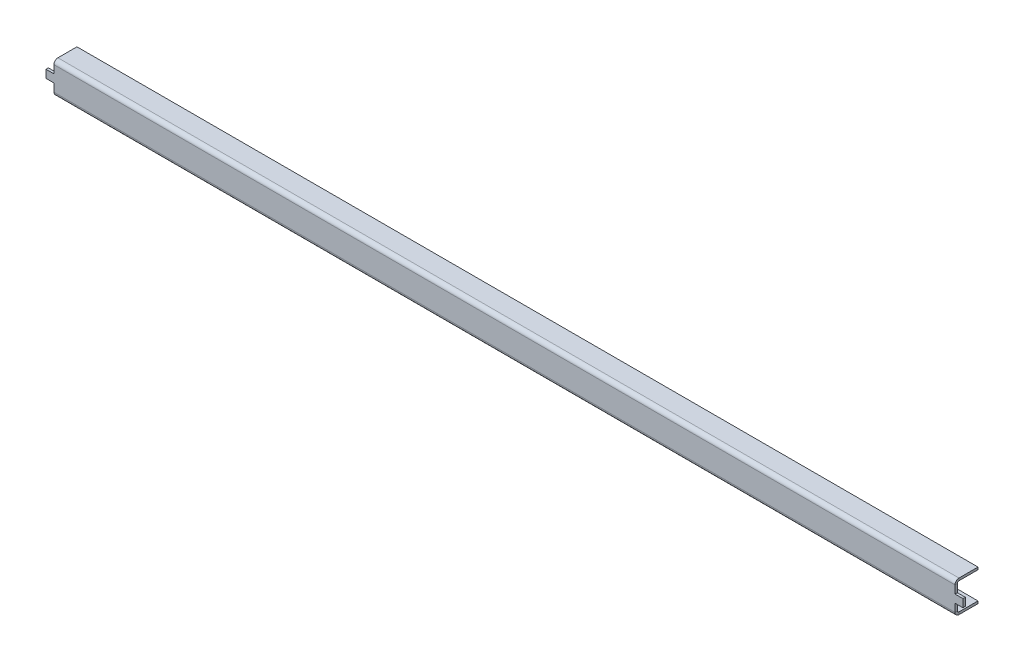
ISO-10303-21;
HEADER;
FILE_DESCRIPTION(('STEP AP214'),'2;1');
FILE_NAME('part.step','',(''),(''),'','','');
FILE_SCHEMA(('AUTOMOTIVE_DESIGN { 1 0 10303 214 1 1 1 1 }'));
ENDSEC;
DATA;
#1=APPLICATION_CONTEXT('core data for automotive mechanical design processes');
#2=APPLICATION_PROTOCOL_DEFINITION('international standard','automotive_design',2000,#1);
#3=PRODUCT_CONTEXT('',#1,'mechanical');
#4=PRODUCT('Part','Part','',(#3));
#5=PRODUCT_RELATED_PRODUCT_CATEGORY('part','',(#4));
#6=PRODUCT_DEFINITION_FORMATION('','',#4);
#7=PRODUCT_DEFINITION_CONTEXT('part definition',#1,'design');
#8=PRODUCT_DEFINITION('design','',#6,#7);
#9=PRODUCT_DEFINITION_SHAPE('','',#8);
#10=(LENGTH_UNIT() NAMED_UNIT(*) SI_UNIT(.MILLI.,.METRE.));
#11=(NAMED_UNIT(*) PLANE_ANGLE_UNIT() SI_UNIT($,.RADIAN.));
#12=(NAMED_UNIT(*) SI_UNIT($,.STERADIAN.) SOLID_ANGLE_UNIT());
#13=UNCERTAINTY_MEASURE_WITH_UNIT(LENGTH_MEASURE(1.E-05),#10,'distance_accuracy_value','');
#14=(GEOMETRIC_REPRESENTATION_CONTEXT(3) GLOBAL_UNCERTAINTY_ASSIGNED_CONTEXT((#13)) GLOBAL_UNIT_ASSIGNED_CONTEXT((#10,
#11,#12)) REPRESENTATION_CONTEXT('',''));
#15=CARTESIAN_POINT('',(0.,0.,0.));
#16=DIRECTION('',(0.,0.,1.));
#17=DIRECTION('',(1.,0.,0.));
#18=AXIS2_PLACEMENT_3D('',#15,#16,#17);
#19=CARTESIAN_POINT('',(284.,1461.75349284392,4.32986979603811E-12));
#20=DIRECTION('',(0.,0.,1.));
#21=DIRECTION('',(0.,-1.,0.));
#22=AXIS2_PLACEMENT_3D('',#19,#20,#21);
#23=PLANE('',#22);
#24=DIRECTION('',(0.,-1.,0.));
#25=VECTOR('',#24,1.);
#26=CARTESIAN_POINT('',(284.,1461.75349284392,4.32986979603811E-12));
#27=LINE('',#26,#25);
#28=CARTESIAN_POINT('',(284.,325.5,0.));
#29=VERTEX_POINT('',#28);
#30=CARTESIAN_POINT('',(284.,324.,0.));
#31=VERTEX_POINT('',#30);
#32=EDGE_CURVE('E289',#29,#31,#27,.T.);
#33=ORIENTED_EDGE('',*,*,#32,.T.);
#34=DIRECTION('',(1.,0.,0.));
#35=VECTOR('',#34,1.);
#36=CARTESIAN_POINT('',(284.,324.,0.));
#37=LINE('',#36,#35);
#38=CARTESIAN_POINT('',(-284.,324.,0.));
#39=VERTEX_POINT('',#38);
#40=EDGE_CURVE('E77',#31,#39,#37,.F.);
#41=ORIENTED_EDGE('',*,*,#40,.T.);
#42=DIRECTION('',(0.,-1.,0.));
#43=VECTOR('',#42,1.);
#44=CARTESIAN_POINT('',(-284.,1461.75349284392,4.32986979603811E-12));
#45=LINE('',#44,#43);
#46=CARTESIAN_POINT('',(-284.,325.5,0.));
#47=VERTEX_POINT('',#46);
#48=EDGE_CURVE('E501',#47,#39,#45,.T.);
#49=ORIENTED_EDGE('',*,*,#48,.F.);
#50=DIRECTION('',(1.,0.,0.));
#51=VECTOR('',#50,1.);
#52=CARTESIAN_POINT('',(284.,325.5,0.));
#53=LINE('',#52,#51);
#54=EDGE_CURVE('E12',#29,#47,#53,.F.);
#55=ORIENTED_EDGE('',*,*,#54,.F.);
#56=EDGE_LOOP('',(#33,#41,#49,#55));
#57=FACE_BOUND('',#56,.T.);
#58=ADVANCED_FACE('F53',(#57),#23,.F.);
#59=CARTESIAN_POINT('',(284.,1461.75349284392,12.0000000000043));
#60=DIRECTION('',(1.,0.,0.));
#61=DIRECTION('',(0.,1.,0.));
#62=AXIS2_PLACEMENT_3D('',#59,#60,#61);
#63=PLANE('',#62);
#64=DIRECTION('',(0.,0.,-1.));
#65=VECTOR('',#64,1.);
#66=CARTESIAN_POINT('',(284.,324.,12.0000000000001));
#67=LINE('',#66,#65);
#68=CARTESIAN_POINT('',(284.,324.,12.));
#69=VERTEX_POINT('',#68);
#70=EDGE_CURVE('E266',#69,#31,#67,.T.);
#71=ORIENTED_EDGE('',*,*,#70,.T.);
#72=ORIENTED_EDGE('',*,*,#32,.F.);
#73=DIRECTION('',(0.,0.,-1.));
#74=VECTOR('',#73,1.);
#75=CARTESIAN_POINT('',(284.,325.5,12.));
#76=LINE('',#75,#74);
#77=CARTESIAN_POINT('',(284.,325.5,12.0000000000001));
#78=VERTEX_POINT('',#77);
#79=EDGE_CURVE('E111',#29,#78,#76,.F.);
#80=ORIENTED_EDGE('',*,*,#79,.T.);
#81=DIRECTION('',(0.,-1.,0.));
#82=VECTOR('',#81,1.);
#83=CARTESIAN_POINT('',(284.,1461.75349284392,12.0000000000044));
#84=LINE('',#83,#82);
#85=EDGE_CURVE('E264',#78,#69,#84,.T.);
#86=ORIENTED_EDGE('',*,*,#85,.T.);
#87=EDGE_LOOP('',(#71,#72,#80,#86));
#88=FACE_BOUND('',#87,.T.);
#89=ADVANCED_FACE('F265',(#88),#63,.T.);
#90=CARTESIAN_POINT('',(284.,324.,14.5000000000001));
#91=DIRECTION('',(0.,1.,0.));
#92=DIRECTION('',(0.,0.,1.));
#93=AXIS2_PLACEMENT_3D('',#90,#91,#92);
#94=PLANE('',#93);
#95=DIRECTION('',(0.,0.,1.));
#96=VECTOR('',#95,1.);
#97=CARTESIAN_POINT('',(-284.,324.,12.));
#98=LINE('',#97,#96);
#99=CARTESIAN_POINT('',(-284.,324.,12.0000000000001));
#100=VERTEX_POINT('',#99);
#101=EDGE_CURVE('E272',#39,#100,#98,.T.);
#102=ORIENTED_EDGE('',*,*,#101,.F.);
#103=ORIENTED_EDGE('',*,*,#40,.F.);
#104=ORIENTED_EDGE('',*,*,#70,.F.);
#105=DIRECTION('',(-1.,0.,0.));
#106=VECTOR('',#105,1.);
#107=CARTESIAN_POINT('',(284.,324.,12.0000000000001));
#108=LINE('',#107,#106);
#109=EDGE_CURVE('E277',#100,#69,#108,.F.);
#110=ORIENTED_EDGE('',*,*,#109,.F.);
#111=EDGE_LOOP('',(#102,#103,#104,#110));
#112=FACE_BOUND('',#111,.T.);
#113=ADVANCED_FACE('F276',(#112),#94,.F.);
#114=CARTESIAN_POINT('',(-284.,1461.75349284392,12.0000000000043));
#115=DIRECTION('',(-1.,0.,0.));
#116=DIRECTION('',(0.,-1.,0.));
#117=AXIS2_PLACEMENT_3D('',#114,#115,#116);
#118=PLANE('',#117);
#119=ORIENTED_EDGE('',*,*,#101,.T.);
#120=DIRECTION('',(0.,-1.,0.));
#121=VECTOR('',#120,1.);
#122=CARTESIAN_POINT('',(-284.,1461.75349284392,12.0000000000044));
#123=LINE('',#122,#121);
#124=CARTESIAN_POINT('',(-284.,325.5,12.0000000000001));
#125=VERTEX_POINT('',#124);
#126=EDGE_CURVE('E58',#125,#100,#123,.T.);
#127=ORIENTED_EDGE('',*,*,#126,.F.);
#128=DIRECTION('',(0.,0.,1.));
#129=VECTOR('',#128,1.);
#130=CARTESIAN_POINT('',(-284.,325.5,12.));
#131=LINE('',#130,#129);
#132=EDGE_CURVE('E485',#125,#47,#131,.F.);
#133=ORIENTED_EDGE('',*,*,#132,.T.);
#134=ORIENTED_EDGE('',*,*,#48,.T.);
#135=EDGE_LOOP('',(#119,#127,#133,#134));
#136=FACE_BOUND('',#135,.T.);
#137=ADVANCED_FACE('F644',(#136),#118,.T.);
#138=CARTESIAN_POINT('',(284.,325.5,14.5000000000001));
#139=DIRECTION('',(0.,1.,0.));
#140=DIRECTION('',(0.,0.,1.));
#141=AXIS2_PLACEMENT_3D('',#138,#139,#140);
#142=PLANE('',#141);
#143=ORIENTED_EDGE('',*,*,#132,.F.);
#144=DIRECTION('',(-1.,0.,0.));
#145=VECTOR('',#144,1.);
#146=CARTESIAN_POINT('',(284.,325.5,12.0000000000001));
#147=LINE('',#146,#145);
#148=EDGE_CURVE('E65',#125,#78,#147,.F.);
#149=ORIENTED_EDGE('',*,*,#148,.T.);
#150=ORIENTED_EDGE('',*,*,#79,.F.);
#151=ORIENTED_EDGE('',*,*,#54,.T.);
#152=EDGE_LOOP('',(#143,#149,#150,#151));
#153=FACE_BOUND('',#152,.T.);
#154=ADVANCED_FACE('F56',(#153),#142,.T.);
#155=CARTESIAN_POINT('',(284.,-793.753492843917,4.38538094726937E-12));
#156=DIRECTION('',(0.,0.,1.));
#157=DIRECTION('',(0.,-1.,0.));
#158=AXIS2_PLACEMENT_3D('',#155,#156,#157);
#159=PLANE('',#158);
#160=DIRECTION('',(0.,1.,0.));
#161=VECTOR('',#160,1.);
#162=CARTESIAN_POINT('',(-284.,-793.753492843917,4.38538094726937E-12));
#163=LINE('',#162,#161);
#164=CARTESIAN_POINT('',(-284.,342.5,0.));
#165=VERTEX_POINT('',#164);
#166=CARTESIAN_POINT('',(-284.,344.,0.));
#167=VERTEX_POINT('',#166);
#168=EDGE_CURVE('E477',#165,#167,#163,.T.);
#169=ORIENTED_EDGE('',*,*,#168,.T.);
#170=DIRECTION('',(1.,0.,0.));
#171=VECTOR('',#170,1.);
#172=CARTESIAN_POINT('',(284.,344.,0.));
#173=LINE('',#172,#171);
#174=CARTESIAN_POINT('',(284.,344.,0.));
#175=VERTEX_POINT('',#174);
#176=EDGE_CURVE('E472',#167,#175,#173,.T.);
#177=ORIENTED_EDGE('',*,*,#176,.T.);
#178=DIRECTION('',(0.,1.,0.));
#179=VECTOR('',#178,1.);
#180=CARTESIAN_POINT('',(284.,-793.753492843917,4.38538094726937E-12));
#181=LINE('',#180,#179);
#182=CARTESIAN_POINT('',(284.,342.5,0.));
#183=VERTEX_POINT('',#182);
#184=EDGE_CURVE('E451',#183,#175,#181,.T.);
#185=ORIENTED_EDGE('',*,*,#184,.F.);
#186=DIRECTION('',(1.,0.,0.));
#187=VECTOR('',#186,1.);
#188=CARTESIAN_POINT('',(284.,342.5,0.));
#189=LINE('',#188,#187);
#190=EDGE_CURVE('E446',#165,#183,#189,.T.);
#191=ORIENTED_EDGE('',*,*,#190,.F.);
#192=EDGE_LOOP('',(#169,#177,#185,#191));
#193=FACE_BOUND('',#192,.T.);
#194=ADVANCED_FACE('F518',(#193),#159,.F.);
#195=CARTESIAN_POINT('',(-284.,-793.753492843917,12.0000000000044));
#196=DIRECTION('',(-1.,0.,0.));
#197=DIRECTION('',(0.,1.,0.));
#198=AXIS2_PLACEMENT_3D('',#195,#196,#197);
#199=PLANE('',#198);
#200=DIRECTION('',(0.,0.,1.));
#201=VECTOR('',#200,1.);
#202=CARTESIAN_POINT('',(-284.,344.,12.));
#203=LINE('',#202,#201);
#204=CARTESIAN_POINT('',(-284.,344.,12.));
#205=VERTEX_POINT('',#204);
#206=EDGE_CURVE('E468',#205,#167,#203,.F.);
#207=ORIENTED_EDGE('',*,*,#206,.T.);
#208=ORIENTED_EDGE('',*,*,#168,.F.);
#209=DIRECTION('',(0.,0.,1.));
#210=VECTOR('',#209,1.);
#211=CARTESIAN_POINT('',(-284.,342.5,12.));
#212=LINE('',#211,#210);
#213=CARTESIAN_POINT('',(-284.,342.5,12.));
#214=VERTEX_POINT('',#213);
#215=EDGE_CURVE('E155',#165,#214,#212,.T.);
#216=ORIENTED_EDGE('',*,*,#215,.T.);
#217=DIRECTION('',(0.,1.,0.));
#218=VECTOR('',#217,1.);
#219=CARTESIAN_POINT('',(-284.,-793.753492843917,12.0000000000044));
#220=LINE('',#219,#218);
#221=EDGE_CURVE('E463',#214,#205,#220,.T.);
#222=ORIENTED_EDGE('',*,*,#221,.T.);
#223=EDGE_LOOP('',(#207,#208,#216,#222));
#224=FACE_BOUND('',#223,.T.);
#225=ADVANCED_FACE('F519',(#224),#199,.T.);
#226=CARTESIAN_POINT('',(284.,344.,0.));
#227=DIRECTION('',(0.,-1.,0.));
#228=DIRECTION('',(0.,0.,-1.));
#229=AXIS2_PLACEMENT_3D('',#226,#227,#228);
#230=PLANE('',#229);
#231=ORIENTED_EDGE('',*,*,#206,.F.);
#232=DIRECTION('',(-1.,0.,0.));
#233=VECTOR('',#232,1.);
#234=CARTESIAN_POINT('',(284.,344.,12.));
#235=LINE('',#234,#233);
#236=CARTESIAN_POINT('',(284.,344.,12.));
#237=VERTEX_POINT('',#236);
#238=EDGE_CURVE('E507',#237,#205,#235,.T.);
#239=ORIENTED_EDGE('',*,*,#238,.F.);
#240=DIRECTION('',(0.,0.,-1.));
#241=VECTOR('',#240,1.);
#242=CARTESIAN_POINT('',(284.,344.,12.));
#243=LINE('',#242,#241);
#244=EDGE_CURVE('E460',#175,#237,#243,.F.);
#245=ORIENTED_EDGE('',*,*,#244,.F.);
#246=ORIENTED_EDGE('',*,*,#176,.F.);
#247=EDGE_LOOP('',(#231,#239,#245,#246));
#248=FACE_BOUND('',#247,.T.);
#249=ADVANCED_FACE('F656',(#248),#230,.F.);
#250=CARTESIAN_POINT('',(284.,-793.753492843917,12.0000000000044));
#251=DIRECTION('',(1.,0.,0.));
#252=DIRECTION('',(0.,-1.,0.));
#253=AXIS2_PLACEMENT_3D('',#250,#251,#252);
#254=PLANE('',#253);
#255=ORIENTED_EDGE('',*,*,#244,.T.);
#256=DIRECTION('',(0.,1.,0.));
#257=VECTOR('',#256,1.);
#258=CARTESIAN_POINT('',(284.,-793.753492843917,12.0000000000044));
#259=LINE('',#258,#257);
#260=CARTESIAN_POINT('',(284.,342.5,12.));
#261=VERTEX_POINT('',#260);
#262=EDGE_CURVE('E148',#261,#237,#259,.T.);
#263=ORIENTED_EDGE('',*,*,#262,.F.);
#264=DIRECTION('',(0.,0.,-1.));
#265=VECTOR('',#264,1.);
#266=CARTESIAN_POINT('',(284.,342.5,12.));
#267=LINE('',#266,#265);
#268=EDGE_CURVE('E123',#261,#183,#267,.T.);
#269=ORIENTED_EDGE('',*,*,#268,.T.);
#270=ORIENTED_EDGE('',*,*,#184,.T.);
#271=EDGE_LOOP('',(#255,#263,#269,#270));
#272=FACE_BOUND('',#271,.T.);
#273=ADVANCED_FACE('F664',(#272),#254,.T.);
#274=CARTESIAN_POINT('',(284.,342.5,0.));
#275=DIRECTION('',(0.,-1.,0.));
#276=DIRECTION('',(0.,0.,-1.));
#277=AXIS2_PLACEMENT_3D('',#274,#275,#276);
#278=PLANE('',#277);
#279=ORIENTED_EDGE('',*,*,#215,.F.);
#280=ORIENTED_EDGE('',*,*,#190,.T.);
#281=ORIENTED_EDGE('',*,*,#268,.F.);
#282=DIRECTION('',(-1.,0.,0.));
#283=VECTOR('',#282,1.);
#284=CARTESIAN_POINT('',(284.,342.5,12.));
#285=LINE('',#284,#283);
#286=EDGE_CURVE('E442',#261,#214,#285,.T.);
#287=ORIENTED_EDGE('',*,*,#286,.T.);
#288=EDGE_LOOP('',(#279,#280,#281,#287));
#289=FACE_BOUND('',#288,.T.);
#290=ADVANCED_FACE('F522',(#289),#278,.T.);
#291=CARTESIAN_POINT('',(284.,344.,14.5));
#292=DIRECTION('',(0.,0.,-1.));
#293=DIRECTION('',(0.,1.,0.));
#294=AXIS2_PLACEMENT_3D('',#291,#292,#293);
#295=PLANE('',#294);
#296=DIRECTION('',(0.,1.,0.));
#297=VECTOR('',#296,1.);
#298=CARTESIAN_POINT('',(-284.,342.5,14.5));
#299=LINE('',#298,#297);
#300=CARTESIAN_POINT('',(-284.,326.5,14.5));
#301=VERTEX_POINT('',#300);
#302=CARTESIAN_POINT('',(-284.,331.5,14.5000000000003));
#303=VERTEX_POINT('',#302);
#304=EDGE_CURVE('E325',#301,#303,#299,.T.);
#305=ORIENTED_EDGE('',*,*,#304,.F.);
#306=DIRECTION('',(1.,0.,0.));
#307=VECTOR('',#306,1.);
#308=CARTESIAN_POINT('',(284.,326.5,14.5));
#309=LINE('',#308,#307);
#310=CARTESIAN_POINT('',(284.,326.5,14.5));
#311=VERTEX_POINT('',#310);
#312=EDGE_CURVE('E330',#311,#301,#309,.F.);
#313=ORIENTED_EDGE('',*,*,#312,.F.);
#314=DIRECTION('',(0.,1.,0.));
#315=VECTOR('',#314,1.);
#316=CARTESIAN_POINT('',(284.,325.5,14.5));
#317=LINE('',#316,#315);
#318=CARTESIAN_POINT('',(284.,331.5,14.5));
#319=VERTEX_POINT('',#318);
#320=EDGE_CURVE('E572',#319,#311,#317,.F.);
#321=ORIENTED_EDGE('',*,*,#320,.F.);
#322=DIRECTION('',(1.,0.,0.));
#323=VECTOR('',#322,1.);
#324=CARTESIAN_POINT('',(284.,331.5,14.5000000000003));
#325=LINE('',#324,#323);
#326=CARTESIAN_POINT('',(289.,331.5,14.5000000000003));
#327=VERTEX_POINT('',#326);
#328=EDGE_CURVE('E580',#319,#327,#325,.T.);
#329=ORIENTED_EDGE('',*,*,#328,.T.);
#330=DIRECTION('',(0.,1.,0.));
#331=VECTOR('',#330,1.);
#332=CARTESIAN_POINT('',(289.,331.5,14.5000000000003));
#333=LINE('',#332,#331);
#334=CARTESIAN_POINT('',(289.,336.5,14.5000000000003));
#335=VERTEX_POINT('',#334);
#336=EDGE_CURVE('E576',#327,#335,#333,.T.);
#337=ORIENTED_EDGE('',*,*,#336,.T.);
#338=DIRECTION('',(-1.,0.,0.));
#339=VECTOR('',#338,1.);
#340=CARTESIAN_POINT('',(284.,336.5,14.5000000000003));
#341=LINE('',#340,#339);
#342=CARTESIAN_POINT('',(284.,336.5,14.5000000000003));
#343=VERTEX_POINT('',#342);
#344=EDGE_CURVE('E571',#335,#343,#341,.T.);
#345=ORIENTED_EDGE('',*,*,#344,.T.);
#346=CARTESIAN_POINT('',(284.,341.5,14.5));
#347=VERTEX_POINT('',#346);
#348=EDGE_CURVE('E567',#347,#343,#317,.F.);
#349=ORIENTED_EDGE('',*,*,#348,.F.);
#350=DIRECTION('',(-1.,0.,0.));
#351=VECTOR('',#350,1.);
#352=CARTESIAN_POINT('',(284.,341.5,14.5));
#353=LINE('',#352,#351);
#354=CARTESIAN_POINT('',(-284.,341.5,14.5));
#355=VERTEX_POINT('',#354);
#356=EDGE_CURVE('E351',#355,#347,#353,.F.);
#357=ORIENTED_EDGE('',*,*,#356,.F.);
#358=CARTESIAN_POINT('',(-284.,336.5,14.5));
#359=VERTEX_POINT('',#358);
#360=EDGE_CURVE('E331',#359,#355,#299,.T.);
#361=ORIENTED_EDGE('',*,*,#360,.F.);
#362=DIRECTION('',(-1.,0.,0.));
#363=VECTOR('',#362,1.);
#364=CARTESIAN_POINT('',(-284.,336.5,14.5000000000003));
#365=LINE('',#364,#363);
#366=CARTESIAN_POINT('',(-289.,336.5,14.5000000000003));
#367=VERTEX_POINT('',#366);
#368=EDGE_CURVE('E346',#359,#367,#365,.T.);
#369=ORIENTED_EDGE('',*,*,#368,.T.);
#370=DIRECTION('',(0.,-1.,0.));
#371=VECTOR('',#370,1.);
#372=CARTESIAN_POINT('',(-289.,336.5,14.5000000000003));
#373=LINE('',#372,#371);
#374=CARTESIAN_POINT('',(-289.,331.5,14.5000000000003));
#375=VERTEX_POINT('',#374);
#376=EDGE_CURVE('E350',#367,#375,#373,.T.);
#377=ORIENTED_EDGE('',*,*,#376,.T.);
#378=DIRECTION('',(1.,0.,0.));
#379=VECTOR('',#378,1.);
#380=CARTESIAN_POINT('',(-284.,331.5,14.5000000000003));
#381=LINE('',#380,#379);
#382=EDGE_CURVE('E355',#375,#303,#381,.T.);
#383=ORIENTED_EDGE('',*,*,#382,.T.);
#384=EDGE_LOOP('',(#305,#313,#321,#329,#337,#345,#349,#357,#361,#369,#377,#383));
#385=FACE_BOUND('',#384,.T.);
#386=ADVANCED_FACE('F562',(#385),#295,.F.);
#387=CARTESIAN_POINT('',(-284.,343.999999999999,-1143.38920783619));
#388=DIRECTION('',(1.,0.,0.));
#389=DIRECTION('',(0.,0.,-1.));
#390=AXIS2_PLACEMENT_3D('',#387,#388,#389);
#391=PLANE('',#390);
#392=DIRECTION('',(0.,0.,1.));
#393=VECTOR('',#392,1.);
#394=CARTESIAN_POINT('',(-284.,326.499999999999,-1143.38920783619));
#395=LINE('',#394,#393);
#396=CARTESIAN_POINT('',(-284.,326.5,13.));
#397=VERTEX_POINT('',#396);
#398=EDGE_CURVE('E400',#397,#301,#395,.T.);
#399=ORIENTED_EDGE('',*,*,#398,.T.);
#400=ORIENTED_EDGE('',*,*,#304,.T.);
#401=DIRECTION('',(0.,0.,1.));
#402=VECTOR('',#401,1.);
#403=CARTESIAN_POINT('',(-284.,331.499999999999,-1143.38920783619));
#404=LINE('',#403,#402);
#405=CARTESIAN_POINT('',(-284.,331.5,13.0000000000001));
#406=VERTEX_POINT('',#405);
#407=EDGE_CURVE('E440',#406,#303,#404,.T.);
#408=ORIENTED_EDGE('',*,*,#407,.F.);
#409=DIRECTION('',(0.,1.,0.));
#410=VECTOR('',#409,1.);
#411=CARTESIAN_POINT('',(-284.,344.,13.));
#412=LINE('',#411,#410);
#413=EDGE_CURVE('E359',#397,#406,#412,.T.);
#414=ORIENTED_EDGE('',*,*,#413,.F.);
#415=EDGE_LOOP('',(#399,#400,#408,#414));
#416=FACE_BOUND('',#415,.T.);
#417=ADVANCED_FACE('F552',(#416),#391,.F.);
#418=CARTESIAN_POINT('',(-284.,331.499999999999,-1143.38920783619));
#419=DIRECTION('',(0.,-1.,0.));
#420=DIRECTION('',(0.,0.,-1.));
#421=AXIS2_PLACEMENT_3D('',#418,#419,#420);
#422=PLANE('',#421);
#423=ORIENTED_EDGE('',*,*,#382,.F.);
#424=DIRECTION('',(0.,0.,1.));
#425=VECTOR('',#424,1.);
#426=CARTESIAN_POINT('',(-289.,331.499999999999,-1143.38920783619));
#427=LINE('',#426,#425);
#428=CARTESIAN_POINT('',(-289.,331.5,13.0000000000001));
#429=VERTEX_POINT('',#428);
#430=EDGE_CURVE('E437',#429,#375,#427,.T.);
#431=ORIENTED_EDGE('',*,*,#430,.F.);
#432=DIRECTION('',(1.,0.,0.));
#433=VECTOR('',#432,1.);
#434=CARTESIAN_POINT('',(-284.,331.5,13.0000000000003));
#435=LINE('',#434,#433);
#436=EDGE_CURVE('E163',#429,#406,#435,.T.);
#437=ORIENTED_EDGE('',*,*,#436,.T.);
#438=ORIENTED_EDGE('',*,*,#407,.T.);
#439=EDGE_LOOP('',(#423,#431,#437,#438));
#440=FACE_BOUND('',#439,.T.);
#441=ADVANCED_FACE('F555',(#440),#422,.T.);
#442=CARTESIAN_POINT('',(-289.,336.499999999999,-1143.38920783619));
#443=DIRECTION('',(-1.,0.,0.));
#444=DIRECTION('',(0.,0.,1.));
#445=AXIS2_PLACEMENT_3D('',#442,#443,#444);
#446=PLANE('',#445);
#447=ORIENTED_EDGE('',*,*,#376,.F.);
#448=DIRECTION('',(0.,0.,1.));
#449=VECTOR('',#448,1.);
#450=CARTESIAN_POINT('',(-289.,336.499999999999,-1143.38920783619));
#451=LINE('',#450,#449);
#452=CARTESIAN_POINT('',(-289.,336.5,13.0000000000001));
#453=VERTEX_POINT('',#452);
#454=EDGE_CURVE('E433',#453,#367,#451,.T.);
#455=ORIENTED_EDGE('',*,*,#454,.F.);
#456=DIRECTION('',(0.,-1.,0.));
#457=VECTOR('',#456,1.);
#458=CARTESIAN_POINT('',(-289.,336.5,13.0000000000003));
#459=LINE('',#458,#457);
#460=EDGE_CURVE('E171',#453,#429,#459,.T.);
#461=ORIENTED_EDGE('',*,*,#460,.T.);
#462=ORIENTED_EDGE('',*,*,#430,.T.);
#463=EDGE_LOOP('',(#447,#455,#461,#462));
#464=FACE_BOUND('',#463,.T.);
#465=ADVANCED_FACE('F558',(#464),#446,.T.);
#466=CARTESIAN_POINT('',(-284.,336.499999999999,-1143.38920783619));
#467=DIRECTION('',(0.,1.,0.));
#468=DIRECTION('',(0.,0.,1.));
#469=AXIS2_PLACEMENT_3D('',#466,#467,#468);
#470=PLANE('',#469);
#471=ORIENTED_EDGE('',*,*,#368,.F.);
#472=DIRECTION('',(0.,0.,1.));
#473=VECTOR('',#472,1.);
#474=CARTESIAN_POINT('',(-284.,336.499999999999,-1143.38920783619));
#475=LINE('',#474,#473);
#476=CARTESIAN_POINT('',(-284.,336.5,13.0000000000001));
#477=VERTEX_POINT('',#476);
#478=EDGE_CURVE('E429',#477,#359,#475,.T.);
#479=ORIENTED_EDGE('',*,*,#478,.F.);
#480=DIRECTION('',(-1.,0.,0.));
#481=VECTOR('',#480,1.);
#482=CARTESIAN_POINT('',(-284.,336.5,13.0000000000003));
#483=LINE('',#482,#481);
#484=EDGE_CURVE('E372',#477,#453,#483,.T.);
#485=ORIENTED_EDGE('',*,*,#484,.T.);
#486=ORIENTED_EDGE('',*,*,#454,.T.);
#487=EDGE_LOOP('',(#471,#479,#485,#486));
#488=FACE_BOUND('',#487,.T.);
#489=ADVANCED_FACE('F561',(#488),#470,.T.);
#490=ORIENTED_EDGE('',*,*,#478,.T.);
#491=ORIENTED_EDGE('',*,*,#360,.T.);
#492=DIRECTION('',(0.,0.,1.));
#493=VECTOR('',#492,1.);
#494=CARTESIAN_POINT('',(-284.,341.499999999999,-1143.38920783619));
#495=LINE('',#494,#493);
#496=CARTESIAN_POINT('',(-284.,341.5,13.));
#497=VERTEX_POINT('',#496);
#498=EDGE_CURVE('E426',#497,#355,#495,.T.);
#499=ORIENTED_EDGE('',*,*,#498,.F.);
#500=EDGE_CURVE('E376',#477,#497,#412,.T.);
#501=ORIENTED_EDGE('',*,*,#500,.F.);
#502=EDGE_LOOP('',(#490,#491,#499,#501));
#503=FACE_BOUND('',#502,.T.);
#504=ADVANCED_FACE('F541',(#503),#391,.F.);
#505=CARTESIAN_POINT('',(284.,343.999999999999,-1143.38920783619));
#506=DIRECTION('',(-1.,0.,0.));
#507=DIRECTION('',(0.,0.,1.));
#508=AXIS2_PLACEMENT_3D('',#505,#506,#507);
#509=PLANE('',#508);
#510=DIRECTION('',(0.,0.,1.));
#511=VECTOR('',#510,1.);
#512=CARTESIAN_POINT('',(284.,341.499999999999,-1143.38920783619));
#513=LINE('',#512,#511);
#514=CARTESIAN_POINT('',(284.,341.5,13.));
#515=VERTEX_POINT('',#514);
#516=EDGE_CURVE('E422',#515,#347,#513,.T.);
#517=ORIENTED_EDGE('',*,*,#516,.T.);
#518=ORIENTED_EDGE('',*,*,#348,.T.);
#519=DIRECTION('',(0.,0.,1.));
#520=VECTOR('',#519,1.);
#521=CARTESIAN_POINT('',(284.,336.499999999999,-1143.38920783619));
#522=LINE('',#521,#520);
#523=CARTESIAN_POINT('',(284.,336.5,13.0000000000001));
#524=VERTEX_POINT('',#523);
#525=EDGE_CURVE('E418',#524,#343,#522,.T.);
#526=ORIENTED_EDGE('',*,*,#525,.F.);
#527=DIRECTION('',(0.,1.,0.));
#528=VECTOR('',#527,1.);
#529=CARTESIAN_POINT('',(284.,344.,13.));
#530=LINE('',#529,#528);
#531=EDGE_CURVE('E388',#515,#524,#530,.F.);
#532=ORIENTED_EDGE('',*,*,#531,.F.);
#533=EDGE_LOOP('',(#517,#518,#526,#532));
#534=FACE_BOUND('',#533,.T.);
#535=ADVANCED_FACE('F607',(#534),#509,.F.);
#536=CARTESIAN_POINT('',(284.,336.499999999999,-1143.38920783619));
#537=DIRECTION('',(0.,1.,0.));
#538=DIRECTION('',(0.,0.,1.));
#539=AXIS2_PLACEMENT_3D('',#536,#537,#538);
#540=PLANE('',#539);
#541=ORIENTED_EDGE('',*,*,#344,.F.);
#542=DIRECTION('',(0.,0.,1.));
#543=VECTOR('',#542,1.);
#544=CARTESIAN_POINT('',(289.,336.499999999999,-1143.38920783619));
#545=LINE('',#544,#543);
#546=CARTESIAN_POINT('',(289.,336.5,13.0000000000001));
#547=VERTEX_POINT('',#546);
#548=EDGE_CURVE('E414',#547,#335,#545,.T.);
#549=ORIENTED_EDGE('',*,*,#548,.F.);
#550=DIRECTION('',(-1.,0.,0.));
#551=VECTOR('',#550,1.);
#552=CARTESIAN_POINT('',(284.,336.5,13.0000000000003));
#553=LINE('',#552,#551);
#554=EDGE_CURVE('E384',#547,#524,#553,.T.);
#555=ORIENTED_EDGE('',*,*,#554,.T.);
#556=ORIENTED_EDGE('',*,*,#525,.T.);
#557=EDGE_LOOP('',(#541,#549,#555,#556));
#558=FACE_BOUND('',#557,.T.);
#559=ADVANCED_FACE('F610',(#558),#540,.T.);
#560=CARTESIAN_POINT('',(289.,331.499999999999,-1143.38920783619));
#561=DIRECTION('',(1.,0.,0.));
#562=DIRECTION('',(0.,0.,-1.));
#563=AXIS2_PLACEMENT_3D('',#560,#561,#562);
#564=PLANE('',#563);
#565=ORIENTED_EDGE('',*,*,#336,.F.);
#566=DIRECTION('',(0.,0.,1.));
#567=VECTOR('',#566,1.);
#568=CARTESIAN_POINT('',(289.,331.499999999999,-1143.38920783619));
#569=LINE('',#568,#567);
#570=CARTESIAN_POINT('',(289.,331.5,13.0000000000001));
#571=VERTEX_POINT('',#570);
#572=EDGE_CURVE('E410',#571,#327,#569,.T.);
#573=ORIENTED_EDGE('',*,*,#572,.F.);
#574=DIRECTION('',(0.,1.,0.));
#575=VECTOR('',#574,1.);
#576=CARTESIAN_POINT('',(289.,331.5,13.0000000000003));
#577=LINE('',#576,#575);
#578=EDGE_CURVE('E387',#571,#547,#577,.T.);
#579=ORIENTED_EDGE('',*,*,#578,.T.);
#580=ORIENTED_EDGE('',*,*,#548,.T.);
#581=EDGE_LOOP('',(#565,#573,#579,#580));
#582=FACE_BOUND('',#581,.T.);
#583=ADVANCED_FACE('F614',(#582),#564,.T.);
#584=CARTESIAN_POINT('',(284.,331.499999999999,-1143.38920783619));
#585=DIRECTION('',(0.,-1.,0.));
#586=DIRECTION('',(0.,0.,-1.));
#587=AXIS2_PLACEMENT_3D('',#584,#585,#586);
#588=PLANE('',#587);
#589=ORIENTED_EDGE('',*,*,#328,.F.);
#590=DIRECTION('',(0.,0.,1.));
#591=VECTOR('',#590,1.);
#592=CARTESIAN_POINT('',(284.,331.499999999999,-1143.38920783619));
#593=LINE('',#592,#591);
#594=CARTESIAN_POINT('',(284.,331.5,13.0000000000001));
#595=VERTEX_POINT('',#594);
#596=EDGE_CURVE('E406',#595,#319,#593,.T.);
#597=ORIENTED_EDGE('',*,*,#596,.F.);
#598=DIRECTION('',(1.,0.,0.));
#599=VECTOR('',#598,1.);
#600=CARTESIAN_POINT('',(284.,331.5,13.0000000000003));
#601=LINE('',#600,#599);
#602=EDGE_CURVE('E391',#595,#571,#601,.T.);
#603=ORIENTED_EDGE('',*,*,#602,.T.);
#604=ORIENTED_EDGE('',*,*,#572,.T.);
#605=EDGE_LOOP('',(#589,#597,#603,#604));
#606=FACE_BOUND('',#605,.T.);
#607=ADVANCED_FACE('F618',(#606),#588,.T.);
#608=ORIENTED_EDGE('',*,*,#596,.T.);
#609=ORIENTED_EDGE('',*,*,#320,.T.);
#610=DIRECTION('',(0.,0.,1.));
#611=VECTOR('',#610,1.);
#612=CARTESIAN_POINT('',(284.,326.499999999999,-1143.38920783619));
#613=LINE('',#612,#611);
#614=CARTESIAN_POINT('',(284.,326.5,13.));
#615=VERTEX_POINT('',#614);
#616=EDGE_CURVE('E292',#615,#311,#613,.T.);
#617=ORIENTED_EDGE('',*,*,#616,.F.);
#618=EDGE_CURVE('E395',#595,#615,#530,.F.);
#619=ORIENTED_EDGE('',*,*,#618,.F.);
#620=EDGE_LOOP('',(#608,#609,#617,#619));
#621=FACE_BOUND('',#620,.T.);
#622=ADVANCED_FACE('F600',(#621),#509,.F.);
#623=CARTESIAN_POINT('',(284.,344.,13.));
#624=DIRECTION('',(0.,0.,-1.));
#625=DIRECTION('',(0.,1.,0.));
#626=AXIS2_PLACEMENT_3D('',#623,#624,#625);
#627=PLANE('',#626);
#628=ORIENTED_EDGE('',*,*,#413,.T.);
#629=ORIENTED_EDGE('',*,*,#436,.F.);
#630=ORIENTED_EDGE('',*,*,#460,.F.);
#631=ORIENTED_EDGE('',*,*,#484,.F.);
#632=ORIENTED_EDGE('',*,*,#500,.T.);
#633=DIRECTION('',(1.,0.,0.));
#634=VECTOR('',#633,1.);
#635=CARTESIAN_POINT('',(284.,341.5,13.));
#636=LINE('',#635,#634);
#637=EDGE_CURVE('E377',#497,#515,#636,.T.);
#638=ORIENTED_EDGE('',*,*,#637,.T.);
#639=ORIENTED_EDGE('',*,*,#531,.T.);
#640=ORIENTED_EDGE('',*,*,#554,.F.);
#641=ORIENTED_EDGE('',*,*,#578,.F.);
#642=ORIENTED_EDGE('',*,*,#602,.F.);
#643=ORIENTED_EDGE('',*,*,#618,.T.);
#644=DIRECTION('',(1.,0.,0.));
#645=VECTOR('',#644,1.);
#646=CARTESIAN_POINT('',(284.,326.5,13.));
#647=LINE('',#646,#645);
#648=EDGE_CURVE('E396',#615,#397,#647,.F.);
#649=ORIENTED_EDGE('',*,*,#648,.T.);
#650=EDGE_LOOP('',(#628,#629,#630,#631,#632,#638,#639,#640,#641,#642,#643,#649));
#651=FACE_BOUND('',#650,.T.);
#652=ADVANCED_FACE('F545',(#651),#627,.T.);
#653=CARTESIAN_POINT('',(284.,341.5,12.));
#654=DIRECTION('',(1.,0.,0.));
#655=DIRECTION('',(0.,0.,-1.));
#656=AXIS2_PLACEMENT_3D('',#653,#654,#655);
#657=PLANE('',#656);
#658=ORIENTED_EDGE('',*,*,#516,.F.);
#659=CARTESIAN_POINT('',(284.,341.5,12.));
#660=DIRECTION('',(1.,0.,0.));
#661=DIRECTION('',(0.,0.,-1.));
#662=AXIS2_PLACEMENT_3D('',#659,#660,#661);
#663=CIRCLE('',#662,0.999999999999973);
#664=EDGE_CURVE('E318',#515,#261,#663,.F.);
#665=ORIENTED_EDGE('',*,*,#664,.T.);
#666=ORIENTED_EDGE('',*,*,#262,.T.);
#667=CARTESIAN_POINT('',(284.,341.5,12.));
#668=DIRECTION('',(1.,0.,0.));
#669=DIRECTION('',(0.,0.,-1.));
#670=AXIS2_PLACEMENT_3D('',#667,#668,#669);
#671=CIRCLE('',#670,2.49999999999997);
#672=EDGE_CURVE('E319',#347,#237,#671,.F.);
#673=ORIENTED_EDGE('',*,*,#672,.F.);
#674=EDGE_LOOP('',(#658,#665,#666,#673));
#675=FACE_BOUND('',#674,.T.);
#676=ADVANCED_FACE('F671',(#675),#657,.T.);
#677=CARTESIAN_POINT('',(-284.,341.5,12.));
#678=DIRECTION('',(-1.,0.,0.));
#679=DIRECTION('',(0.,0.,1.));
#680=AXIS2_PLACEMENT_3D('',#677,#678,#679);
#681=PLANE('',#680);
#682=ORIENTED_EDGE('',*,*,#221,.F.);
#683=CARTESIAN_POINT('',(-284.,341.5,12.));
#684=DIRECTION('',(1.,0.,0.));
#685=DIRECTION('',(0.,0.,-1.));
#686=AXIS2_PLACEMENT_3D('',#683,#684,#685);
#687=CIRCLE('',#686,0.999999999999973);
#688=EDGE_CURVE('E298',#214,#497,#687,.T.);
#689=ORIENTED_EDGE('',*,*,#688,.T.);
#690=ORIENTED_EDGE('',*,*,#498,.T.);
#691=CARTESIAN_POINT('',(-284.,341.5,12.));
#692=DIRECTION('',(1.,0.,0.));
#693=DIRECTION('',(0.,0.,-1.));
#694=AXIS2_PLACEMENT_3D('',#691,#692,#693);
#695=CIRCLE('',#694,2.49999999999997);
#696=EDGE_CURVE('E324',#205,#355,#695,.T.);
#697=ORIENTED_EDGE('',*,*,#696,.F.);
#698=EDGE_LOOP('',(#682,#689,#690,#697));
#699=FACE_BOUND('',#698,.T.);
#700=ADVANCED_FACE('F529',(#699),#681,.T.);
#701=CARTESIAN_POINT('',(-863.674261978225,341.5,12.));
#702=DIRECTION('',(1.,0.,0.));
#703=DIRECTION('',(0.,0.,-1.));
#704=AXIS2_PLACEMENT_3D('',#701,#702,#703);
#705=CYLINDRICAL_SURFACE('',#704,2.49999999999997);
#706=ORIENTED_EDGE('',*,*,#696,.T.);
#707=ORIENTED_EDGE('',*,*,#356,.T.);
#708=ORIENTED_EDGE('',*,*,#672,.T.);
#709=ORIENTED_EDGE('',*,*,#238,.T.);
#710=EDGE_LOOP('',(#706,#707,#708,#709));
#711=FACE_BOUND('',#710,.T.);
#712=ADVANCED_FACE('F672',(#711),#705,.T.);
#713=CARTESIAN_POINT('',(-863.674261978225,341.5,12.));
#714=DIRECTION('',(1.,0.,0.));
#715=DIRECTION('',(0.,0.,-1.));
#716=AXIS2_PLACEMENT_3D('',#713,#714,#715);
#717=CYLINDRICAL_SURFACE('',#716,0.999999999999973);
#718=ORIENTED_EDGE('',*,*,#688,.F.);
#719=ORIENTED_EDGE('',*,*,#286,.F.);
#720=ORIENTED_EDGE('',*,*,#664,.F.);
#721=ORIENTED_EDGE('',*,*,#637,.F.);
#722=EDGE_LOOP('',(#718,#719,#720,#721));
#723=FACE_BOUND('',#722,.T.);
#724=ADVANCED_FACE('F531',(#723),#717,.F.);
#725=CARTESIAN_POINT('',(-284.,326.5,12.0000000000001));
#726=DIRECTION('',(-1.,0.,0.));
#727=DIRECTION('',(0.,0.,1.));
#728=AXIS2_PLACEMENT_3D('',#725,#726,#727);
#729=PLANE('',#728);
#730=ORIENTED_EDGE('',*,*,#398,.F.);
#731=CARTESIAN_POINT('',(-284.,326.5,12.0000000000001));
#732=DIRECTION('',(-1.,0.,0.));
#733=DIRECTION('',(0.,0.,1.));
#734=AXIS2_PLACEMENT_3D('',#731,#732,#733);
#735=CIRCLE('',#734,0.999999999999974);
#736=EDGE_CURVE('E294',#397,#125,#735,.F.);
#737=ORIENTED_EDGE('',*,*,#736,.T.);
#738=ORIENTED_EDGE('',*,*,#126,.T.);
#739=CARTESIAN_POINT('',(-284.,326.5,12.0000000000001));
#740=DIRECTION('',(-1.,0.,0.));
#741=DIRECTION('',(0.,0.,1.));
#742=AXIS2_PLACEMENT_3D('',#739,#740,#741);
#743=CIRCLE('',#742,2.49999999999997);
#744=EDGE_CURVE('E287',#301,#100,#743,.F.);
#745=ORIENTED_EDGE('',*,*,#744,.F.);
#746=EDGE_LOOP('',(#730,#737,#738,#745));
#747=FACE_BOUND('',#746,.T.);
#748=ADVANCED_FACE('F586',(#747),#729,.T.);
#749=CARTESIAN_POINT('',(284.,326.5,12.0000000000001));
#750=DIRECTION('',(1.,0.,0.));
#751=DIRECTION('',(0.,0.,-1.));
#752=AXIS2_PLACEMENT_3D('',#749,#750,#751);
#753=PLANE('',#752);
#754=ORIENTED_EDGE('',*,*,#85,.F.);
#755=CARTESIAN_POINT('',(284.,326.5,12.0000000000001));
#756=DIRECTION('',(-1.,0.,0.));
#757=DIRECTION('',(0.,0.,1.));
#758=AXIS2_PLACEMENT_3D('',#755,#756,#757);
#759=CIRCLE('',#758,0.999999999999974);
#760=EDGE_CURVE('E301',#78,#615,#759,.T.);
#761=ORIENTED_EDGE('',*,*,#760,.T.);
#762=ORIENTED_EDGE('',*,*,#616,.T.);
#763=CARTESIAN_POINT('',(284.,326.5,12.0000000000001));
#764=DIRECTION('',(-1.,0.,0.));
#765=DIRECTION('',(0.,0.,1.));
#766=AXIS2_PLACEMENT_3D('',#763,#764,#765);
#767=CIRCLE('',#766,2.49999999999997);
#768=EDGE_CURVE('E284',#69,#311,#767,.T.);
#769=ORIENTED_EDGE('',*,*,#768,.F.);
#770=EDGE_LOOP('',(#754,#761,#762,#769));
#771=FACE_BOUND('',#770,.T.);
#772=ADVANCED_FACE('F290',(#771),#753,.T.);
#773=CARTESIAN_POINT('',(863.066706001995,326.5,12.0000000000001));
#774=DIRECTION('',(-1.,0.,0.));
#775=DIRECTION('',(0.,0.,1.));
#776=AXIS2_PLACEMENT_3D('',#773,#774,#775);
#777=CYLINDRICAL_SURFACE('',#776,2.49999999999997);
#778=ORIENTED_EDGE('',*,*,#768,.T.);
#779=ORIENTED_EDGE('',*,*,#312,.T.);
#780=ORIENTED_EDGE('',*,*,#744,.T.);
#781=ORIENTED_EDGE('',*,*,#109,.T.);
#782=EDGE_LOOP('',(#778,#779,#780,#781));
#783=FACE_BOUND('',#782,.T.);
#784=ADVANCED_FACE('F283',(#783),#777,.T.);
#785=CARTESIAN_POINT('',(863.066706001995,326.5,12.0000000000001));
#786=DIRECTION('',(-1.,0.,0.));
#787=DIRECTION('',(0.,0.,1.));
#788=AXIS2_PLACEMENT_3D('',#785,#786,#787);
#789=CYLINDRICAL_SURFACE('',#788,0.999999999999974);
#790=ORIENTED_EDGE('',*,*,#760,.F.);
#791=ORIENTED_EDGE('',*,*,#148,.F.);
#792=ORIENTED_EDGE('',*,*,#736,.F.);
#793=ORIENTED_EDGE('',*,*,#648,.F.);
#794=EDGE_LOOP('',(#790,#791,#792,#793));
#795=FACE_BOUND('',#794,.T.);
#796=ADVANCED_FACE('F599',(#795),#789,.F.);
#797=CLOSED_SHELL('',(#58,#89,#113,#137,#154,#194,#225,#249,#273,#290,#386,#417,#441,#465,#489,
#504,#535,#559,#583,#607,#622,#652,#676,#700,#712,#724,#748,#772,#784,#796));
#798=MANIFOLD_SOLID_BREP('B2',#797);
#799=ADVANCED_BREP_SHAPE_REPRESENTATION('',(#18,#798),#14);
#800=SHAPE_DEFINITION_REPRESENTATION(#9,#799);
ENDSEC;
END-ISO-10303-21;
